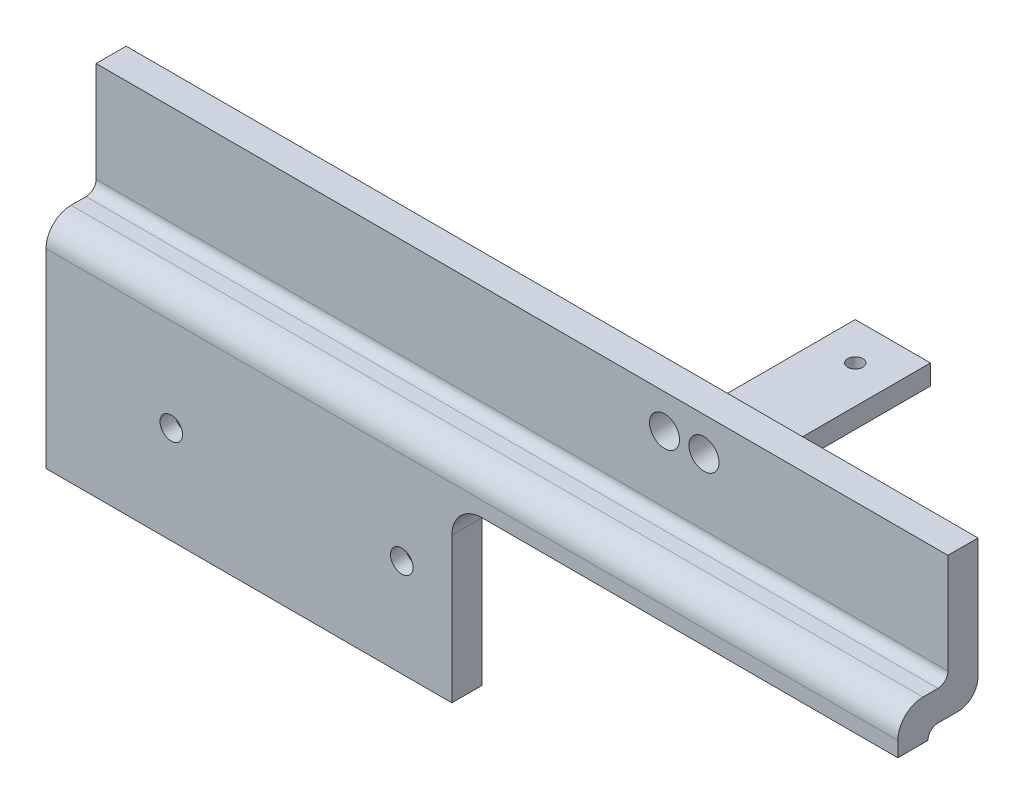
ISO-10303-21;
HEADER;
FILE_DESCRIPTION(('STEP AP214'),'2;1');
FILE_NAME('part.step','',(''),(''),'','','');
FILE_SCHEMA(('AUTOMOTIVE_DESIGN { 1 0 10303 214 1 1 1 1 }'));
ENDSEC;
DATA;
#1=APPLICATION_CONTEXT('core data for automotive mechanical design processes');
#2=APPLICATION_PROTOCOL_DEFINITION('international standard','automotive_design',2000,#1);
#3=PRODUCT_CONTEXT('',#1,'mechanical');
#4=PRODUCT('Part','Part','',(#3));
#5=PRODUCT_RELATED_PRODUCT_CATEGORY('part','',(#4));
#6=PRODUCT_DEFINITION_FORMATION('','',#4);
#7=PRODUCT_DEFINITION_CONTEXT('part definition',#1,'design');
#8=PRODUCT_DEFINITION('design','',#6,#7);
#9=PRODUCT_DEFINITION_SHAPE('','',#8);
#10=(LENGTH_UNIT() NAMED_UNIT(*) SI_UNIT(.MILLI.,.METRE.));
#11=(NAMED_UNIT(*) PLANE_ANGLE_UNIT() SI_UNIT($,.RADIAN.));
#12=(NAMED_UNIT(*) SI_UNIT($,.STERADIAN.) SOLID_ANGLE_UNIT());
#13=UNCERTAINTY_MEASURE_WITH_UNIT(LENGTH_MEASURE(1.E-05),#10,'distance_accuracy_value','');
#14=(GEOMETRIC_REPRESENTATION_CONTEXT(3) GLOBAL_UNCERTAINTY_ASSIGNED_CONTEXT((#13)) GLOBAL_UNIT_ASSIGNED_CONTEXT((#10,
#11,#12)) REPRESENTATION_CONTEXT('',''));
#15=CARTESIAN_POINT('',(0.,0.,0.));
#16=DIRECTION('',(0.,0.,1.));
#17=DIRECTION('',(1.,0.,0.));
#18=AXIS2_PLACEMENT_3D('',#15,#16,#17);
#19=CARTESIAN_POINT('',(170.,41.,-16.));
#20=DIRECTION('',(0.,0.,1.));
#21=DIRECTION('',(1.,0.,0.));
#22=AXIS2_PLACEMENT_3D('',#19,#20,#21);
#23=PLANE('',#22);
#24=CARTESIAN_POINT('',(121.31,58.175,-16.));
#25=DIRECTION('',(0.,0.,-1.));
#26=DIRECTION('',(-1.,0.,0.));
#27=AXIS2_PLACEMENT_3D('',#24,#25,#26);
#28=CIRCLE('',#27,3.00000000000001);
#29=CARTESIAN_POINT('',(118.31,58.175,-16.));
#30=VERTEX_POINT('',#29);
#31=EDGE_CURVE('E358',#30,#30,#28,.T.);
#32=ORIENTED_EDGE('',*,*,#31,.F.);
#33=EDGE_LOOP('',(#32));
#34=FACE_BOUND('',#33,.T.);
#35=CARTESIAN_POINT('',(113.436,58.175,-16.));
#36=DIRECTION('',(0.,0.,-1.));
#37=DIRECTION('',(-1.,0.,0.));
#38=AXIS2_PLACEMENT_3D('',#35,#36,#37);
#39=CIRCLE('',#38,3.00000000000001);
#40=CARTESIAN_POINT('',(110.436,58.175,-16.));
#41=VERTEX_POINT('',#40);
#42=EDGE_CURVE('E866',#41,#41,#39,.T.);
#43=ORIENTED_EDGE('',*,*,#42,.F.);
#44=EDGE_LOOP('',(#43));
#45=FACE_BOUND('',#44,.T.);
#46=DIRECTION('',(1.,0.,0.));
#47=VECTOR('',#46,1.);
#48=CARTESIAN_POINT('',(110.,55.,-16.));
#49=LINE('',#48,#47);
#50=CARTESIAN_POINT('',(108.,55.,-16.));
#51=VERTEX_POINT('',#50);
#52=CARTESIAN_POINT('',(127.,55.,-16.));
#53=VERTEX_POINT('',#52);
#54=EDGE_CURVE('E205',#51,#53,#49,.T.);
#55=ORIENTED_EDGE('',*,*,#54,.F.);
#56=DIRECTION('',(0.,-1.,0.));
#57=VECTOR('',#56,1.);
#58=CARTESIAN_POINT('',(108.,41.,-16.));
#59=LINE('',#58,#57);
#60=CARTESIAN_POINT('',(108.,41.,-16.));
#61=VERTEX_POINT('',#60);
#62=EDGE_CURVE('E371',#51,#61,#59,.T.);
#63=ORIENTED_EDGE('',*,*,#62,.T.);
#64=DIRECTION('',(-1.,0.,0.));
#65=VECTOR('',#64,1.);
#66=CARTESIAN_POINT('',(170.,41.,-16.));
#67=LINE('',#66,#65);
#68=CARTESIAN_POINT('',(0.,41.,-16.));
#69=VERTEX_POINT('',#68);
#70=EDGE_CURVE('E314',#61,#69,#67,.T.);
#71=ORIENTED_EDGE('',*,*,#70,.T.);
#72=DIRECTION('',(0.,1.,0.));
#73=VECTOR('',#72,1.);
#74=CARTESIAN_POINT('',(0.,41.,-16.));
#75=LINE('',#74,#73);
#76=CARTESIAN_POINT('',(0.,65.,-16.));
#77=VERTEX_POINT('',#76);
#78=EDGE_CURVE('E286',#69,#77,#75,.T.);
#79=ORIENTED_EDGE('',*,*,#78,.T.);
#80=DIRECTION('',(-1.,0.,0.));
#81=VECTOR('',#80,1.);
#82=CARTESIAN_POINT('',(170.,65.,-16.));
#83=LINE('',#82,#81);
#84=CARTESIAN_POINT('',(170.,65.,-16.));
#85=VERTEX_POINT('',#84);
#86=EDGE_CURVE('E311',#85,#77,#83,.T.);
#87=ORIENTED_EDGE('',*,*,#86,.F.);
#88=DIRECTION('',(0.,1.,0.));
#89=VECTOR('',#88,1.);
#90=CARTESIAN_POINT('',(170.,41.,-16.));
#91=LINE('',#90,#89);
#92=CARTESIAN_POINT('',(170.,41.,-16.));
#93=VERTEX_POINT('',#92);
#94=EDGE_CURVE('E257',#93,#85,#91,.T.);
#95=ORIENTED_EDGE('',*,*,#94,.F.);
#96=CARTESIAN_POINT('',(127.,41.,-16.));
#97=VERTEX_POINT('',#96);
#98=EDGE_CURVE('E315',#93,#97,#67,.T.);
#99=ORIENTED_EDGE('',*,*,#98,.T.);
#100=DIRECTION('',(0.,1.,0.));
#101=VECTOR('',#100,1.);
#102=CARTESIAN_POINT('',(127.,55.,-16.));
#103=LINE('',#102,#101);
#104=EDGE_CURVE('E368',#97,#53,#103,.T.);
#105=ORIENTED_EDGE('',*,*,#104,.T.);
#106=EDGE_LOOP('',(#55,#63,#71,#79,#87,#95,#99,#105));
#107=FACE_BOUND('',#106,.T.);
#108=ADVANCED_FACE('F41',(#34,#45,#107),#23,.F.);
#109=CARTESIAN_POINT('',(170.,38.,0.));
#110=DIRECTION('',(0.,0.,-1.));
#111=DIRECTION('',(0.,1.,0.));
#112=AXIS2_PLACEMENT_3D('',#109,#110,#111);
#113=PLANE('',#112);
#114=CARTESIAN_POINT('',(25.,19.5,0.));
#115=DIRECTION('',(0.,0.,-1.));
#116=DIRECTION('',(0.,1.,0.));
#117=AXIS2_PLACEMENT_3D('',#114,#115,#116);
#118=CIRCLE('',#117,2.24999999999999);
#119=CARTESIAN_POINT('',(25.,21.75,0.));
#120=VERTEX_POINT('',#119);
#121=EDGE_CURVE('E236',#120,#120,#118,.T.);
#122=ORIENTED_EDGE('',*,*,#121,.T.);
#123=EDGE_LOOP('',(#122));
#124=FACE_BOUND('',#123,.T.);
#125=CARTESIAN_POINT('',(71.,19.5,0.));
#126=DIRECTION('',(0.,0.,-1.));
#127=DIRECTION('',(0.,1.,0.));
#128=AXIS2_PLACEMENT_3D('',#125,#126,#127);
#129=CIRCLE('',#128,2.25);
#130=CARTESIAN_POINT('',(71.,21.75,0.));
#131=VERTEX_POINT('',#130);
#132=EDGE_CURVE('E246',#131,#131,#129,.T.);
#133=ORIENTED_EDGE('',*,*,#132,.T.);
#134=EDGE_LOOP('',(#133));
#135=FACE_BOUND('',#134,.T.);
#136=DIRECTION('',(0.,1.,0.));
#137=VECTOR('',#136,1.);
#138=CARTESIAN_POINT('',(81.,37.9999999999999,0.));
#139=LINE('',#138,#137);
#140=CARTESIAN_POINT('',(81.,0.,0.));
#141=VERTEX_POINT('',#140);
#142=CARTESIAN_POINT('',(81.,29.,0.));
#143=VERTEX_POINT('',#142);
#144=EDGE_CURVE('E224',#141,#143,#139,.T.);
#145=ORIENTED_EDGE('',*,*,#144,.T.);
#146=CARTESIAN_POINT('',(87.,29.,0.));
#147=DIRECTION('',(0.,0.,-1.));
#148=DIRECTION('',(0.,1.,0.));
#149=AXIS2_PLACEMENT_3D('',#146,#147,#148);
#150=CIRCLE('',#149,6.);
#151=CARTESIAN_POINT('',(87.,35.,0.));
#152=VERTEX_POINT('',#151);
#153=EDGE_CURVE('E347',#143,#152,#150,.T.);
#154=ORIENTED_EDGE('',*,*,#153,.T.);
#155=DIRECTION('',(1.,0.,0.));
#156=VECTOR('',#155,1.);
#157=CARTESIAN_POINT('',(170.,35.,0.));
#158=LINE('',#157,#156);
#159=CARTESIAN_POINT('',(170.,35.,0.));
#160=VERTEX_POINT('',#159);
#161=EDGE_CURVE('E222',#152,#160,#158,.T.);
#162=ORIENTED_EDGE('',*,*,#161,.T.);
#163=DIRECTION('',(0.,-1.,0.));
#164=VECTOR('',#163,1.);
#165=CARTESIAN_POINT('',(170.,38.,0.));
#166=LINE('',#165,#164);
#167=CARTESIAN_POINT('',(170.,38.,0.));
#168=VERTEX_POINT('',#167);
#169=EDGE_CURVE('E247',#168,#160,#166,.T.);
#170=ORIENTED_EDGE('',*,*,#169,.F.);
#171=DIRECTION('',(-1.,0.,0.));
#172=VECTOR('',#171,1.);
#173=CARTESIAN_POINT('',(170.,38.,0.));
#174=LINE('',#173,#172);
#175=CARTESIAN_POINT('',(0.,38.,0.));
#176=VERTEX_POINT('',#175);
#177=EDGE_CURVE('E269',#168,#176,#174,.T.);
#178=ORIENTED_EDGE('',*,*,#177,.T.);
#179=DIRECTION('',(0.,-1.,0.));
#180=VECTOR('',#179,1.);
#181=CARTESIAN_POINT('',(0.,38.,0.));
#182=LINE('',#181,#180);
#183=CARTESIAN_POINT('',(0.,0.,0.));
#184=VERTEX_POINT('',#183);
#185=EDGE_CURVE('E270',#176,#184,#182,.T.);
#186=ORIENTED_EDGE('',*,*,#185,.T.);
#187=DIRECTION('',(-1.,0.,0.));
#188=VECTOR('',#187,1.);
#189=CARTESIAN_POINT('',(170.,0.,0.));
#190=LINE('',#189,#188);
#191=EDGE_CURVE('E331',#141,#184,#190,.T.);
#192=ORIENTED_EDGE('',*,*,#191,.F.);
#193=EDGE_LOOP('',(#145,#154,#162,#170,#178,#186,#192));
#194=FACE_BOUND('',#193,.T.);
#195=ADVANCED_FACE('F445',(#124,#135,#194),#113,.F.);
#196=CARTESIAN_POINT('',(170.,0.,0.));
#197=DIRECTION('',(0.,1.,0.));
#198=DIRECTION('',(0.,0.,1.));
#199=AXIS2_PLACEMENT_3D('',#196,#197,#198);
#200=PLANE('',#199);
#201=DIRECTION('',(-1.,0.,0.));
#202=VECTOR('',#201,1.);
#203=CARTESIAN_POINT('',(170.,0.,-6.));
#204=LINE('',#203,#202);
#205=CARTESIAN_POINT('',(81.,0.,-6.));
#206=VERTEX_POINT('',#205);
#207=CARTESIAN_POINT('',(0.,0.,-6.));
#208=VERTEX_POINT('',#207);
#209=EDGE_CURVE('E329',#206,#208,#204,.T.);
#210=ORIENTED_EDGE('',*,*,#209,.F.);
#211=DIRECTION('',(0.,0.,-1.));
#212=VECTOR('',#211,1.);
#213=CARTESIAN_POINT('',(81.,0.,164.));
#214=LINE('',#213,#212);
#215=EDGE_CURVE('E215',#141,#206,#214,.T.);
#216=ORIENTED_EDGE('',*,*,#215,.F.);
#217=ORIENTED_EDGE('',*,*,#191,.T.);
#218=DIRECTION('',(0.,0.,-1.));
#219=VECTOR('',#218,1.);
#220=CARTESIAN_POINT('',(0.,0.,0.));
#221=LINE('',#220,#219);
#222=EDGE_CURVE('E273',#184,#208,#221,.T.);
#223=ORIENTED_EDGE('',*,*,#222,.T.);
#224=EDGE_LOOP('',(#210,#216,#217,#223));
#225=FACE_BOUND('',#224,.T.);
#226=ADVANCED_FACE('F441',(#225),#200,.F.);
#227=CARTESIAN_POINT('',(170.,0.,-6.));
#228=DIRECTION('',(0.,0.,1.));
#229=DIRECTION('',(1.,0.,0.));
#230=AXIS2_PLACEMENT_3D('',#227,#228,#229);
#231=PLANE('',#230);
#232=CARTESIAN_POINT('',(25.,19.5,-6.));
#233=DIRECTION('',(0.,0.,-1.));
#234=DIRECTION('',(-1.,0.,0.));
#235=AXIS2_PLACEMENT_3D('',#232,#233,#234);
#236=CIRCLE('',#235,4.99999999999999);
#237=CARTESIAN_POINT('',(20.,19.5,-6.));
#238=VERTEX_POINT('',#237);
#239=EDGE_CURVE('E227',#238,#238,#236,.T.);
#240=ORIENTED_EDGE('',*,*,#239,.F.);
#241=EDGE_LOOP('',(#240));
#242=FACE_BOUND('',#241,.T.);
#243=CARTESIAN_POINT('',(71.,19.5,-6.));
#244=DIRECTION('',(0.,0.,-1.));
#245=DIRECTION('',(-1.,0.,0.));
#246=AXIS2_PLACEMENT_3D('',#243,#244,#245);
#247=CIRCLE('',#246,4.99999999999999);
#248=CARTESIAN_POINT('',(66.,19.5,-6.));
#249=VERTEX_POINT('',#248);
#250=EDGE_CURVE('E237',#249,#249,#247,.T.);
#251=ORIENTED_EDGE('',*,*,#250,.F.);
#252=EDGE_LOOP('',(#251));
#253=FACE_BOUND('',#252,.T.);
#254=DIRECTION('',(-1.,0.,0.));
#255=VECTOR('',#254,1.);
#256=CARTESIAN_POINT('',(170.,35.,-6.));
#257=LINE('',#256,#255);
#258=CARTESIAN_POINT('',(87.,35.,-6.));
#259=VERTEX_POINT('',#258);
#260=CARTESIAN_POINT('',(0.,35.,-6.));
#261=VERTEX_POINT('',#260);
#262=EDGE_CURVE('E325',#259,#261,#257,.T.);
#263=ORIENTED_EDGE('',*,*,#262,.F.);
#264=CARTESIAN_POINT('',(87.,29.,-6.00000000000001));
#265=DIRECTION('',(0.,0.,1.));
#266=DIRECTION('',(1.,0.,0.));
#267=AXIS2_PLACEMENT_3D('',#264,#265,#266);
#268=CIRCLE('',#267,6.);
#269=CARTESIAN_POINT('',(81.,29.,-6.));
#270=VERTEX_POINT('',#269);
#271=EDGE_CURVE('E345',#259,#270,#268,.T.);
#272=ORIENTED_EDGE('',*,*,#271,.T.);
#273=DIRECTION('',(0.,1.,0.));
#274=VECTOR('',#273,1.);
#275=CARTESIAN_POINT('',(81.,0.,-6.));
#276=LINE('',#275,#274);
#277=EDGE_CURVE('E212',#206,#270,#276,.T.);
#278=ORIENTED_EDGE('',*,*,#277,.F.);
#279=ORIENTED_EDGE('',*,*,#209,.T.);
#280=DIRECTION('',(0.,1.,0.));
#281=VECTOR('',#280,1.);
#282=CARTESIAN_POINT('',(0.,0.,-6.));
#283=LINE('',#282,#281);
#284=EDGE_CURVE('E276',#208,#261,#283,.T.);
#285=ORIENTED_EDGE('',*,*,#284,.T.);
#286=EDGE_LOOP('',(#263,#272,#278,#279,#285));
#287=FACE_BOUND('',#286,.T.);
#288=ADVANCED_FACE('F436',(#242,#253,#287),#231,.F.);
#289=CARTESIAN_POINT('',(170.,35.,-8.));
#290=DIRECTION('',(-1.,0.,0.));
#291=DIRECTION('',(0.,0.,1.));
#292=AXIS2_PLACEMENT_3D('',#289,#290,#291);
#293=CYLINDRICAL_SURFACE('',#292,2.);
#294=CARTESIAN_POINT('',(0.,35.,-8.));
#295=DIRECTION('',(-1.,0.,0.));
#296=DIRECTION('',(0.,0.,-1.));
#297=AXIS2_PLACEMENT_3D('',#294,#295,#296);
#298=CIRCLE('',#297,2.);
#299=CARTESIAN_POINT('',(0.,37.,-8.00000000000001));
#300=VERTEX_POINT('',#299);
#301=EDGE_CURVE('E279',#261,#300,#298,.T.);
#302=ORIENTED_EDGE('',*,*,#301,.T.);
#303=DIRECTION('',(-1.,0.,0.));
#304=VECTOR('',#303,1.);
#305=CARTESIAN_POINT('',(170.,37.,-8.00000000000001));
#306=LINE('',#305,#304);
#307=CARTESIAN_POINT('',(170.,37.,-8.00000000000001));
#308=VERTEX_POINT('',#307);
#309=EDGE_CURVE('E322',#308,#300,#306,.T.);
#310=ORIENTED_EDGE('',*,*,#309,.F.);
#311=CARTESIAN_POINT('',(170.,35.,-8.));
#312=DIRECTION('',(-1.,0.,0.));
#313=DIRECTION('',(0.,0.,-1.));
#314=AXIS2_PLACEMENT_3D('',#311,#312,#313);
#315=CIRCLE('',#314,2.);
#316=CARTESIAN_POINT('',(170.,35.,-6.));
#317=VERTEX_POINT('',#316);
#318=EDGE_CURVE('E250',#317,#308,#315,.T.);
#319=ORIENTED_EDGE('',*,*,#318,.F.);
#320=EDGE_CURVE('E326',#317,#259,#257,.T.);
#321=ORIENTED_EDGE('',*,*,#320,.T.);
#322=ORIENTED_EDGE('',*,*,#262,.T.);
#323=EDGE_LOOP('',(#302,#310,#319,#321,#322));
#324=FACE_BOUND('',#323,.T.);
#325=ADVANCED_FACE('F433',(#324),#293,.F.);
#326=CARTESIAN_POINT('',(170.,37.,-8.00000000000001));
#327=DIRECTION('',(0.,1.,0.));
#328=DIRECTION('',(0.,0.,1.));
#329=AXIS2_PLACEMENT_3D('',#326,#327,#328);
#330=PLANE('',#329);
#331=DIRECTION('',(0.,0.,-1.));
#332=VECTOR('',#331,1.);
#333=CARTESIAN_POINT('',(0.,37.,-8.00000000000001));
#334=LINE('',#333,#332);
#335=CARTESIAN_POINT('',(0.,37.,-12.));
#336=VERTEX_POINT('',#335);
#337=EDGE_CURVE('E281',#300,#336,#334,.T.);
#338=ORIENTED_EDGE('',*,*,#337,.T.);
#339=DIRECTION('',(-1.,0.,0.));
#340=VECTOR('',#339,1.);
#341=CARTESIAN_POINT('',(170.,37.,-12.));
#342=LINE('',#341,#340);
#343=CARTESIAN_POINT('',(170.,37.,-12.));
#344=VERTEX_POINT('',#343);
#345=EDGE_CURVE('E318',#344,#336,#342,.T.);
#346=ORIENTED_EDGE('',*,*,#345,.F.);
#347=DIRECTION('',(0.,0.,-1.));
#348=VECTOR('',#347,1.);
#349=CARTESIAN_POINT('',(170.,37.,-8.00000000000001));
#350=LINE('',#349,#348);
#351=EDGE_CURVE('E253',#308,#344,#350,.T.);
#352=ORIENTED_EDGE('',*,*,#351,.F.);
#353=ORIENTED_EDGE('',*,*,#309,.T.);
#354=EDGE_LOOP('',(#338,#346,#352,#353));
#355=FACE_BOUND('',#354,.T.);
#356=ADVANCED_FACE('F428',(#355),#330,.F.);
#357=CARTESIAN_POINT('',(170.,41.,-12.));
#358=DIRECTION('',(-1.,0.,0.));
#359=DIRECTION('',(0.,0.,1.));
#360=AXIS2_PLACEMENT_3D('',#357,#358,#359);
#361=CYLINDRICAL_SURFACE('',#360,4.);
#362=CARTESIAN_POINT('',(0.,41.,-12.));
#363=DIRECTION('',(1.,0.,0.));
#364=DIRECTION('',(0.,0.,-1.));
#365=AXIS2_PLACEMENT_3D('',#362,#363,#364);
#366=CIRCLE('',#365,4.);
#367=EDGE_CURVE('E283',#336,#69,#366,.T.);
#368=ORIENTED_EDGE('',*,*,#367,.T.);
#369=ORIENTED_EDGE('',*,*,#70,.F.);
#370=EDGE_CURVE('E319',#97,#61,#67,.T.);
#371=ORIENTED_EDGE('',*,*,#370,.F.);
#372=ORIENTED_EDGE('',*,*,#98,.F.);
#373=CARTESIAN_POINT('',(170.,41.,-12.));
#374=DIRECTION('',(1.,0.,0.));
#375=DIRECTION('',(0.,0.,-1.));
#376=AXIS2_PLACEMENT_3D('',#373,#374,#375);
#377=CIRCLE('',#376,4.);
#378=EDGE_CURVE('E255',#344,#93,#377,.T.);
#379=ORIENTED_EDGE('',*,*,#378,.F.);
#380=ORIENTED_EDGE('',*,*,#345,.T.);
#381=EDGE_LOOP('',(#368,#369,#371,#372,#379,#380));
#382=FACE_BOUND('',#381,.T.);
#383=ADVANCED_FACE('F405',(#382),#361,.T.);
#384=CARTESIAN_POINT('',(170.,65.,-16.));
#385=DIRECTION('',(0.,-1.,0.));
#386=DIRECTION('',(0.,0.,-1.));
#387=AXIS2_PLACEMENT_3D('',#384,#385,#386);
#388=PLANE('',#387);
#389=DIRECTION('',(0.,0.,1.));
#390=VECTOR('',#389,1.);
#391=CARTESIAN_POINT('',(0.,65.,-16.));
#392=LINE('',#391,#390);
#393=CARTESIAN_POINT('',(0.,65.,-10.));
#394=VERTEX_POINT('',#393);
#395=EDGE_CURVE('E288',#77,#394,#392,.T.);
#396=ORIENTED_EDGE('',*,*,#395,.T.);
#397=DIRECTION('',(-1.,0.,0.));
#398=VECTOR('',#397,1.);
#399=CARTESIAN_POINT('',(170.,65.,-10.));
#400=LINE('',#399,#398);
#401=CARTESIAN_POINT('',(170.,65.,-10.));
#402=VERTEX_POINT('',#401);
#403=EDGE_CURVE('E308',#402,#394,#400,.T.);
#404=ORIENTED_EDGE('',*,*,#403,.F.);
#405=DIRECTION('',(0.,0.,1.));
#406=VECTOR('',#405,1.);
#407=CARTESIAN_POINT('',(170.,65.,-16.));
#408=LINE('',#407,#406);
#409=EDGE_CURVE('E259',#85,#402,#408,.T.);
#410=ORIENTED_EDGE('',*,*,#409,.F.);
#411=ORIENTED_EDGE('',*,*,#86,.T.);
#412=EDGE_LOOP('',(#396,#404,#410,#411));
#413=FACE_BOUND('',#412,.T.);
#414=ADVANCED_FACE('F417',(#413),#388,.F.);
#415=CARTESIAN_POINT('',(170.,65.,-10.));
#416=DIRECTION('',(0.,0.,-1.));
#417=DIRECTION('',(0.,1.,0.));
#418=AXIS2_PLACEMENT_3D('',#415,#416,#417);
#419=PLANE('',#418);
#420=CARTESIAN_POINT('',(121.31,58.175,-10.));
#421=DIRECTION('',(0.,0.,-1.));
#422=DIRECTION('',(0.,1.,0.));
#423=AXIS2_PLACEMENT_3D('',#420,#421,#422);
#424=CIRCLE('',#423,3.00000000000001);
#425=CARTESIAN_POINT('',(121.31,61.175,-10.));
#426=VERTEX_POINT('',#425);
#427=EDGE_CURVE('E357',#426,#426,#424,.T.);
#428=ORIENTED_EDGE('',*,*,#427,.T.);
#429=EDGE_LOOP('',(#428));
#430=FACE_BOUND('',#429,.T.);
#431=CARTESIAN_POINT('',(113.436,58.175,-10.));
#432=DIRECTION('',(0.,0.,-1.));
#433=DIRECTION('',(0.,1.,0.));
#434=AXIS2_PLACEMENT_3D('',#431,#432,#433);
#435=CIRCLE('',#434,3.00000000000001);
#436=CARTESIAN_POINT('',(113.436,61.175,-10.));
#437=VERTEX_POINT('',#436);
#438=EDGE_CURVE('E354',#437,#437,#435,.T.);
#439=ORIENTED_EDGE('',*,*,#438,.T.);
#440=EDGE_LOOP('',(#439));
#441=FACE_BOUND('',#440,.T.);
#442=DIRECTION('',(0.,-1.,0.));
#443=VECTOR('',#442,1.);
#444=CARTESIAN_POINT('',(0.,65.,-10.));
#445=LINE('',#444,#443);
#446=CARTESIAN_POINT('',(0.,45.,-10.));
#447=VERTEX_POINT('',#446);
#448=EDGE_CURVE('E290',#394,#447,#445,.T.);
#449=ORIENTED_EDGE('',*,*,#448,.T.);
#450=DIRECTION('',(-1.,0.,0.));
#451=VECTOR('',#450,1.);
#452=CARTESIAN_POINT('',(170.,45.,-10.));
#453=LINE('',#452,#451);
#454=CARTESIAN_POINT('',(170.,45.,-10.));
#455=VERTEX_POINT('',#454);
#456=EDGE_CURVE('E305',#455,#447,#453,.T.);
#457=ORIENTED_EDGE('',*,*,#456,.F.);
#458=DIRECTION('',(0.,-1.,0.));
#459=VECTOR('',#458,1.);
#460=CARTESIAN_POINT('',(170.,65.,-10.));
#461=LINE('',#460,#459);
#462=EDGE_CURVE('E261',#402,#455,#461,.T.);
#463=ORIENTED_EDGE('',*,*,#462,.F.);
#464=ORIENTED_EDGE('',*,*,#403,.T.);
#465=EDGE_LOOP('',(#449,#457,#463,#464));
#466=FACE_BOUND('',#465,.T.);
#467=ADVANCED_FACE('F462',(#430,#441,#466),#419,.F.);
#468=CARTESIAN_POINT('',(170.,45.,-8.00000000000001));
#469=DIRECTION('',(-1.,0.,0.));
#470=DIRECTION('',(0.,0.,1.));
#471=AXIS2_PLACEMENT_3D('',#468,#469,#470);
#472=CYLINDRICAL_SURFACE('',#471,2.);
#473=CARTESIAN_POINT('',(0.,45.,-8.00000000000001));
#474=DIRECTION('',(-1.,0.,0.));
#475=DIRECTION('',(0.,0.,1.));
#476=AXIS2_PLACEMENT_3D('',#473,#474,#475);
#477=CIRCLE('',#476,2.);
#478=CARTESIAN_POINT('',(0.,43.,-7.99999999999999));
#479=VERTEX_POINT('',#478);
#480=EDGE_CURVE('E292',#447,#479,#477,.T.);
#481=ORIENTED_EDGE('',*,*,#480,.T.);
#482=DIRECTION('',(-1.,0.,0.));
#483=VECTOR('',#482,1.);
#484=CARTESIAN_POINT('',(170.,43.,-7.99999999999999));
#485=LINE('',#484,#483);
#486=CARTESIAN_POINT('',(170.,43.,-7.99999999999999));
#487=VERTEX_POINT('',#486);
#488=EDGE_CURVE('E302',#487,#479,#485,.T.);
#489=ORIENTED_EDGE('',*,*,#488,.F.);
#490=CARTESIAN_POINT('',(170.,45.,-8.00000000000001));
#491=DIRECTION('',(-1.,0.,0.));
#492=DIRECTION('',(0.,0.,1.));
#493=AXIS2_PLACEMENT_3D('',#490,#491,#492);
#494=CIRCLE('',#493,2.);
#495=EDGE_CURVE('E263',#455,#487,#494,.T.);
#496=ORIENTED_EDGE('',*,*,#495,.F.);
#497=ORIENTED_EDGE('',*,*,#456,.T.);
#498=EDGE_LOOP('',(#481,#489,#496,#497));
#499=FACE_BOUND('',#498,.T.);
#500=ADVANCED_FACE('F460',(#499),#472,.F.);
#501=CARTESIAN_POINT('',(170.,43.,-7.99999999999999));
#502=DIRECTION('',(0.,-1.,0.));
#503=DIRECTION('',(0.,0.,-1.));
#504=AXIS2_PLACEMENT_3D('',#501,#502,#503);
#505=PLANE('',#504);
#506=DIRECTION('',(0.,0.,1.));
#507=VECTOR('',#506,1.);
#508=CARTESIAN_POINT('',(0.,43.,-7.99999999999999));
#509=LINE('',#508,#507);
#510=CARTESIAN_POINT('',(0.,43.,-5.00000000000003));
#511=VERTEX_POINT('',#510);
#512=EDGE_CURVE('E294',#479,#511,#509,.T.);
#513=ORIENTED_EDGE('',*,*,#512,.T.);
#514=DIRECTION('',(-1.,0.,0.));
#515=VECTOR('',#514,1.);
#516=CARTESIAN_POINT('',(170.,43.,-5.00000000000003));
#517=LINE('',#516,#515);
#518=CARTESIAN_POINT('',(170.,43.,-5.00000000000003));
#519=VERTEX_POINT('',#518);
#520=EDGE_CURVE('E299',#519,#511,#517,.T.);
#521=ORIENTED_EDGE('',*,*,#520,.F.);
#522=DIRECTION('',(0.,0.,1.));
#523=VECTOR('',#522,1.);
#524=CARTESIAN_POINT('',(170.,43.,-7.99999999999999));
#525=LINE('',#524,#523);
#526=EDGE_CURVE('E265',#487,#519,#525,.T.);
#527=ORIENTED_EDGE('',*,*,#526,.F.);
#528=ORIENTED_EDGE('',*,*,#488,.T.);
#529=EDGE_LOOP('',(#513,#521,#527,#528));
#530=FACE_BOUND('',#529,.T.);
#531=ADVANCED_FACE('F455',(#530),#505,.F.);
#532=CARTESIAN_POINT('',(170.,38.,-5.));
#533=DIRECTION('',(-1.,0.,0.));
#534=DIRECTION('',(0.,0.,1.));
#535=AXIS2_PLACEMENT_3D('',#532,#533,#534);
#536=CYLINDRICAL_SURFACE('',#535,5.);
#537=CARTESIAN_POINT('',(0.,38.,-5.));
#538=DIRECTION('',(1.,0.,0.));
#539=DIRECTION('',(0.,0.,-1.));
#540=AXIS2_PLACEMENT_3D('',#537,#538,#539);
#541=CIRCLE('',#540,5.);
#542=EDGE_CURVE('E251',#511,#176,#541,.T.);
#543=ORIENTED_EDGE('',*,*,#542,.T.);
#544=ORIENTED_EDGE('',*,*,#177,.F.);
#545=CARTESIAN_POINT('',(170.,38.,-5.));
#546=DIRECTION('',(1.,0.,0.));
#547=DIRECTION('',(0.,0.,-1.));
#548=AXIS2_PLACEMENT_3D('',#545,#546,#547);
#549=CIRCLE('',#548,5.);
#550=EDGE_CURVE('E267',#519,#168,#549,.T.);
#551=ORIENTED_EDGE('',*,*,#550,.F.);
#552=ORIENTED_EDGE('',*,*,#520,.T.);
#553=EDGE_LOOP('',(#543,#544,#551,#552));
#554=FACE_BOUND('',#553,.T.);
#555=ADVANCED_FACE('F450',(#554),#536,.T.);
#556=CARTESIAN_POINT('',(170.,35.,-8.));
#557=DIRECTION('',(1.,0.,0.));
#558=DIRECTION('',(0.,0.,-1.));
#559=AXIS2_PLACEMENT_3D('',#556,#557,#558);
#560=PLANE('',#559);
#561=DIRECTION('',(0.,0.,1.));
#562=VECTOR('',#561,1.);
#563=CARTESIAN_POINT('',(170.,35.,-8.));
#564=LINE('',#563,#562);
#565=EDGE_CURVE('E333',#317,#160,#564,.T.);
#566=ORIENTED_EDGE('',*,*,#565,.F.);
#567=ORIENTED_EDGE('',*,*,#318,.T.);
#568=ORIENTED_EDGE('',*,*,#351,.T.);
#569=ORIENTED_EDGE('',*,*,#378,.T.);
#570=ORIENTED_EDGE('',*,*,#94,.T.);
#571=ORIENTED_EDGE('',*,*,#409,.T.);
#572=ORIENTED_EDGE('',*,*,#462,.T.);
#573=ORIENTED_EDGE('',*,*,#495,.T.);
#574=ORIENTED_EDGE('',*,*,#526,.T.);
#575=ORIENTED_EDGE('',*,*,#550,.T.);
#576=ORIENTED_EDGE('',*,*,#169,.T.);
#577=EDGE_LOOP('',(#566,#567,#568,#569,#570,#571,#572,#573,#574,#575,#576));
#578=FACE_BOUND('',#577,.T.);
#579=ADVANCED_FACE('F422',(#578),#560,.T.);
#580=CARTESIAN_POINT('',(0.,35.,-8.));
#581=DIRECTION('',(1.,0.,0.));
#582=DIRECTION('',(0.,0.,-1.));
#583=AXIS2_PLACEMENT_3D('',#580,#581,#582);
#584=PLANE('',#583);
#585=ORIENTED_EDGE('',*,*,#185,.F.);
#586=ORIENTED_EDGE('',*,*,#542,.F.);
#587=ORIENTED_EDGE('',*,*,#512,.F.);
#588=ORIENTED_EDGE('',*,*,#480,.F.);
#589=ORIENTED_EDGE('',*,*,#448,.F.);
#590=ORIENTED_EDGE('',*,*,#395,.F.);
#591=ORIENTED_EDGE('',*,*,#78,.F.);
#592=ORIENTED_EDGE('',*,*,#367,.F.);
#593=ORIENTED_EDGE('',*,*,#337,.F.);
#594=ORIENTED_EDGE('',*,*,#301,.F.);
#595=ORIENTED_EDGE('',*,*,#284,.F.);
#596=ORIENTED_EDGE('',*,*,#222,.F.);
#597=EDGE_LOOP('',(#585,#586,#587,#588,#589,#590,#591,#592,#593,#594,#595,#596));
#598=FACE_BOUND('',#597,.T.);
#599=ADVANCED_FACE('F413',(#598),#584,.F.);
#600=CARTESIAN_POINT('',(71.,19.5,-6.));
#601=DIRECTION('',(0.,0.,-1.));
#602=DIRECTION('',(-1.,0.,0.));
#603=AXIS2_PLACEMENT_3D('',#600,#601,#602);
#604=CYLINDRICAL_SURFACE('',#603,2.25);
#605=CARTESIAN_POINT('',(71.,19.5,-3.));
#606=DIRECTION('',(0.,0.,-1.));
#607=DIRECTION('',(-1.,0.,0.));
#608=AXIS2_PLACEMENT_3D('',#605,#606,#607);
#609=CIRCLE('',#608,2.25);
#610=CARTESIAN_POINT('',(68.75,19.5,-3.));
#611=VERTEX_POINT('',#610);
#612=EDGE_CURVE('E243',#611,#611,#609,.T.);
#613=ORIENTED_EDGE('',*,*,#612,.T.);
#614=EDGE_LOOP('',(#613));
#615=FACE_BOUND('',#614,.T.);
#616=ORIENTED_EDGE('',*,*,#132,.F.);
#617=EDGE_LOOP('',(#616));
#618=FACE_BOUND('',#617,.T.);
#619=ADVANCED_FACE('F748',(#615,#618),#604,.F.);
#620=CARTESIAN_POINT('',(73.25,19.5,-3.));
#621=DIRECTION('',(0.,0.,1.));
#622=DIRECTION('',(1.,0.,0.));
#623=AXIS2_PLACEMENT_3D('',#620,#621,#622);
#624=PLANE('',#623);
#625=ORIENTED_EDGE('',*,*,#612,.F.);
#626=EDGE_LOOP('',(#625));
#627=FACE_BOUND('',#626,.T.);
#628=CARTESIAN_POINT('',(71.,19.5,-3.));
#629=DIRECTION('',(0.,0.,-1.));
#630=DIRECTION('',(-1.,0.,0.));
#631=AXIS2_PLACEMENT_3D('',#628,#629,#630);
#632=CIRCLE('',#631,4.99999999999999);
#633=CARTESIAN_POINT('',(66.,19.5,-3.));
#634=VERTEX_POINT('',#633);
#635=EDGE_CURVE('E240',#634,#634,#632,.T.);
#636=ORIENTED_EDGE('',*,*,#635,.T.);
#637=EDGE_LOOP('',(#636));
#638=FACE_BOUND('',#637,.T.);
#639=ADVANCED_FACE('F737',(#627,#638),#624,.F.);
#640=CARTESIAN_POINT('',(71.,19.5,-6.));
#641=DIRECTION('',(0.,0.,-1.));
#642=DIRECTION('',(-1.,0.,0.));
#643=AXIS2_PLACEMENT_3D('',#640,#641,#642);
#644=CYLINDRICAL_SURFACE('',#643,4.99999999999999);
#645=ORIENTED_EDGE('',*,*,#635,.F.);
#646=EDGE_LOOP('',(#645));
#647=FACE_BOUND('',#646,.T.);
#648=ORIENTED_EDGE('',*,*,#250,.T.);
#649=EDGE_LOOP('',(#648));
#650=FACE_BOUND('',#649,.T.);
#651=ADVANCED_FACE('F726',(#647,#650),#644,.F.);
#652=CARTESIAN_POINT('',(25.,19.5,-6.));
#653=DIRECTION('',(0.,0.,-1.));
#654=DIRECTION('',(-1.,0.,0.));
#655=AXIS2_PLACEMENT_3D('',#652,#653,#654);
#656=CYLINDRICAL_SURFACE('',#655,2.24999999999999);
#657=CARTESIAN_POINT('',(25.,19.5,-3.));
#658=DIRECTION('',(0.,0.,-1.));
#659=DIRECTION('',(-1.,0.,0.));
#660=AXIS2_PLACEMENT_3D('',#657,#658,#659);
#661=CIRCLE('',#660,2.25);
#662=CARTESIAN_POINT('',(22.75,19.5,-3.));
#663=VERTEX_POINT('',#662);
#664=EDGE_CURVE('E233',#663,#663,#661,.T.);
#665=ORIENTED_EDGE('',*,*,#664,.T.);
#666=EDGE_LOOP('',(#665));
#667=FACE_BOUND('',#666,.T.);
#668=ORIENTED_EDGE('',*,*,#121,.F.);
#669=EDGE_LOOP('',(#668));
#670=FACE_BOUND('',#669,.T.);
#671=ADVANCED_FACE('F715',(#667,#670),#656,.F.);
#672=CARTESIAN_POINT('',(27.25,19.5,-3.));
#673=DIRECTION('',(0.,0.,1.));
#674=DIRECTION('',(1.,0.,0.));
#675=AXIS2_PLACEMENT_3D('',#672,#673,#674);
#676=PLANE('',#675);
#677=ORIENTED_EDGE('',*,*,#664,.F.);
#678=EDGE_LOOP('',(#677));
#679=FACE_BOUND('',#678,.T.);
#680=CARTESIAN_POINT('',(25.,19.5,-3.));
#681=DIRECTION('',(0.,0.,-1.));
#682=DIRECTION('',(-1.,0.,0.));
#683=AXIS2_PLACEMENT_3D('',#680,#681,#682);
#684=CIRCLE('',#683,4.99999999999999);
#685=CARTESIAN_POINT('',(20.,19.5,-3.));
#686=VERTEX_POINT('',#685);
#687=EDGE_CURVE('E230',#686,#686,#684,.T.);
#688=ORIENTED_EDGE('',*,*,#687,.T.);
#689=EDGE_LOOP('',(#688));
#690=FACE_BOUND('',#689,.T.);
#691=ADVANCED_FACE('F704',(#679,#690),#676,.F.);
#692=CARTESIAN_POINT('',(25.,19.5,-6.));
#693=DIRECTION('',(0.,0.,-1.));
#694=DIRECTION('',(-1.,0.,0.));
#695=AXIS2_PLACEMENT_3D('',#692,#693,#694);
#696=CYLINDRICAL_SURFACE('',#695,4.99999999999999);
#697=ORIENTED_EDGE('',*,*,#687,.F.);
#698=EDGE_LOOP('',(#697));
#699=FACE_BOUND('',#698,.T.);
#700=ORIENTED_EDGE('',*,*,#239,.T.);
#701=EDGE_LOOP('',(#700));
#702=FACE_BOUND('',#701,.T.);
#703=ADVANCED_FACE('F652',(#699,#702),#696,.F.);
#704=CARTESIAN_POINT('',(81.,0.,164.));
#705=DIRECTION('',(-1.,0.,0.));
#706=DIRECTION('',(0.,-1.,0.));
#707=AXIS2_PLACEMENT_3D('',#704,#705,#706);
#708=PLANE('',#707);
#709=ORIENTED_EDGE('',*,*,#277,.T.);
#710=DIRECTION('',(0.,0.,-1.));
#711=VECTOR('',#710,1.);
#712=CARTESIAN_POINT('',(81.,29.,0.));
#713=LINE('',#712,#711);
#714=EDGE_CURVE('E343',#270,#143,#713,.F.);
#715=ORIENTED_EDGE('',*,*,#714,.T.);
#716=ORIENTED_EDGE('',*,*,#144,.F.);
#717=ORIENTED_EDGE('',*,*,#215,.T.);
#718=EDGE_LOOP('',(#709,#715,#716,#717));
#719=FACE_BOUND('',#718,.T.);
#720=ADVANCED_FACE('F641',(#719),#708,.F.);
#721=CARTESIAN_POINT('',(170.,35.,164.));
#722=DIRECTION('',(0.,1.,0.));
#723=DIRECTION('',(0.,0.,1.));
#724=AXIS2_PLACEMENT_3D('',#721,#722,#723);
#725=PLANE('',#724);
#726=ORIENTED_EDGE('',*,*,#161,.F.);
#727=DIRECTION('',(0.,0.,-1.));
#728=VECTOR('',#727,1.);
#729=CARTESIAN_POINT('',(87.,35.,-6.00000000000001));
#730=LINE('',#729,#728);
#731=EDGE_CURVE('E340',#152,#259,#730,.T.);
#732=ORIENTED_EDGE('',*,*,#731,.T.);
#733=ORIENTED_EDGE('',*,*,#320,.F.);
#734=ORIENTED_EDGE('',*,*,#565,.T.);
#735=EDGE_LOOP('',(#726,#732,#733,#734));
#736=FACE_BOUND('',#735,.T.);
#737=ADVANCED_FACE('F498',(#736),#725,.F.);
#738=CARTESIAN_POINT('',(87.,29.,164.));
#739=DIRECTION('',(0.,0.,1.));
#740=DIRECTION('',(1.,0.,0.));
#741=AXIS2_PLACEMENT_3D('',#738,#739,#740);
#742=CYLINDRICAL_SURFACE('',#741,6.);
#743=ORIENTED_EDGE('',*,*,#153,.F.);
#744=ORIENTED_EDGE('',*,*,#714,.F.);
#745=ORIENTED_EDGE('',*,*,#271,.F.);
#746=ORIENTED_EDGE('',*,*,#731,.F.);
#747=EDGE_LOOP('',(#743,#744,#745,#746));
#748=FACE_BOUND('',#747,.T.);
#749=ADVANCED_FACE('F495',(#748),#742,.F.);
#750=CARTESIAN_POINT('',(110.,55.,-51.5));
#751=DIRECTION('',(1.,0.,0.));
#752=DIRECTION('',(0.,1.,0.));
#753=AXIS2_PLACEMENT_3D('',#750,#751,#752);
#754=PLANE('',#753);
#755=DIRECTION('',(0.,0.707106781186544,-0.707106781186551));
#756=VECTOR('',#755,1.);
#757=CARTESIAN_POINT('',(110.,65.7499999999999,-40.7500000000002));
#758=LINE('',#757,#756);
#759=CARTESIAN_POINT('',(110.,51.,-26.0000000000001));
#760=VERTEX_POINT('',#759);
#761=CARTESIAN_POINT('',(110.,43.,-18.));
#762=VERTEX_POINT('',#761);
#763=EDGE_CURVE('E363',#760,#762,#758,.F.);
#764=ORIENTED_EDGE('',*,*,#763,.T.);
#765=DIRECTION('',(0.,1.,0.));
#766=VECTOR('',#765,1.);
#767=CARTESIAN_POINT('',(110.,55.,-18.));
#768=LINE('',#767,#766);
#769=CARTESIAN_POINT('',(110.,55.,-18.));
#770=VERTEX_POINT('',#769);
#771=EDGE_CURVE('E211',#762,#770,#768,.T.);
#772=ORIENTED_EDGE('',*,*,#771,.T.);
#773=DIRECTION('',(0.,0.,1.));
#774=VECTOR('',#773,1.);
#775=CARTESIAN_POINT('',(110.,55.,-51.5));
#776=LINE('',#775,#774);
#777=CARTESIAN_POINT('',(110.,55.,-51.5));
#778=VERTEX_POINT('',#777);
#779=EDGE_CURVE('E191',#778,#770,#776,.T.);
#780=ORIENTED_EDGE('',*,*,#779,.F.);
#781=DIRECTION('',(0.,1.,0.));
#782=VECTOR('',#781,1.);
#783=CARTESIAN_POINT('',(110.,55.,-51.5));
#784=LINE('',#783,#782);
#785=CARTESIAN_POINT('',(110.,51.,-51.5));
#786=VERTEX_POINT('',#785);
#787=EDGE_CURVE('E196',#786,#778,#784,.T.);
#788=ORIENTED_EDGE('',*,*,#787,.F.);
#789=DIRECTION('',(0.,0.,1.));
#790=VECTOR('',#789,1.);
#791=CARTESIAN_POINT('',(110.,51.,-51.5));
#792=LINE('',#791,#790);
#793=EDGE_CURVE('E394',#786,#760,#792,.T.);
#794=ORIENTED_EDGE('',*,*,#793,.T.);
#795=EDGE_LOOP('',(#764,#772,#780,#788,#794));
#796=FACE_BOUND('',#795,.T.);
#797=ADVANCED_FACE('F209',(#796),#754,.F.);
#798=CARTESIAN_POINT('',(110.,55.,-51.5));
#799=DIRECTION('',(0.,-1.,0.));
#800=DIRECTION('',(0.,0.,-1.));
#801=AXIS2_PLACEMENT_3D('',#798,#799,#800);
#802=PLANE('',#801);
#803=CARTESIAN_POINT('',(117.5,55.,-44.));
#804=DIRECTION('',(0.,1.,0.));
#805=DIRECTION('',(0.,0.,1.));
#806=AXIS2_PLACEMENT_3D('',#803,#804,#805);
#807=CIRCLE('',#806,1.5);
#808=CARTESIAN_POINT('',(117.5,55.,-42.5));
#809=VERTEX_POINT('',#808);
#810=EDGE_CURVE('E353',#809,#809,#807,.T.);
#811=ORIENTED_EDGE('',*,*,#810,.F.);
#812=EDGE_LOOP('',(#811));
#813=FACE_BOUND('',#812,.T.);
#814=ORIENTED_EDGE('',*,*,#54,.T.);
#815=DIRECTION('',(0.707106781186543,0.,0.707106781186552));
#816=VECTOR('',#815,1.);
#817=CARTESIAN_POINT('',(100.75,55.,-42.2500000000002));
#818=LINE('',#817,#816);
#819=CARTESIAN_POINT('',(125.,55.,-18.));
#820=VERTEX_POINT('',#819);
#821=EDGE_CURVE('E11',#53,#820,#818,.F.);
#822=ORIENTED_EDGE('',*,*,#821,.T.);
#823=DIRECTION('',(0.,0.,1.));
#824=VECTOR('',#823,1.);
#825=CARTESIAN_POINT('',(125.,55.,-51.5));
#826=LINE('',#825,#824);
#827=CARTESIAN_POINT('',(125.,55.,-51.5));
#828=VERTEX_POINT('',#827);
#829=EDGE_CURVE('E192',#828,#820,#826,.T.);
#830=ORIENTED_EDGE('',*,*,#829,.F.);
#831=DIRECTION('',(1.,0.,0.));
#832=VECTOR('',#831,1.);
#833=CARTESIAN_POINT('',(110.,55.,-51.5));
#834=LINE('',#833,#832);
#835=EDGE_CURVE('E186',#778,#828,#834,.T.);
#836=ORIENTED_EDGE('',*,*,#835,.F.);
#837=ORIENTED_EDGE('',*,*,#779,.T.);
#838=DIRECTION('',(0.707106781186544,0.,-0.707106781186551));
#839=VECTOR('',#838,1.);
#840=CARTESIAN_POINT('',(126.75,55.,-34.7500000000002));
#841=LINE('',#840,#839);
#842=EDGE_CURVE('E376',#770,#51,#841,.F.);
#843=ORIENTED_EDGE('',*,*,#842,.T.);
#844=EDGE_LOOP('',(#814,#822,#830,#836,#837,#843));
#845=FACE_BOUND('',#844,.T.);
#846=ADVANCED_FACE('F188',(#813,#845),#802,.F.);
#847=CARTESIAN_POINT('',(125.,55.,-51.5));
#848=DIRECTION('',(-1.,0.,0.));
#849=DIRECTION('',(0.,0.,1.));
#850=AXIS2_PLACEMENT_3D('',#847,#848,#849);
#851=PLANE('',#850);
#852=ORIENTED_EDGE('',*,*,#829,.T.);
#853=DIRECTION('',(0.,-1.,0.));
#854=VECTOR('',#853,1.);
#855=CARTESIAN_POINT('',(125.,41.,-18.));
#856=LINE('',#855,#854);
#857=CARTESIAN_POINT('',(125.,43.,-18.));
#858=VERTEX_POINT('',#857);
#859=EDGE_CURVE('E374',#820,#858,#856,.T.);
#860=ORIENTED_EDGE('',*,*,#859,.T.);
#861=DIRECTION('',(0.,-0.707106781186544,0.707106781186551));
#862=VECTOR('',#861,1.);
#863=CARTESIAN_POINT('',(125.,65.7499999999999,-40.7500000000002));
#864=LINE('',#863,#862);
#865=CARTESIAN_POINT('',(125.,51.,-26.0000000000001));
#866=VERTEX_POINT('',#865);
#867=EDGE_CURVE('E365',#858,#866,#864,.F.);
#868=ORIENTED_EDGE('',*,*,#867,.T.);
#869=DIRECTION('',(0.,0.,1.));
#870=VECTOR('',#869,1.);
#871=CARTESIAN_POINT('',(125.,51.,-51.5));
#872=LINE('',#871,#870);
#873=CARTESIAN_POINT('',(125.,51.,-51.5));
#874=VERTEX_POINT('',#873);
#875=EDGE_CURVE('E217',#874,#866,#872,.T.);
#876=ORIENTED_EDGE('',*,*,#875,.F.);
#877=DIRECTION('',(0.,-1.,0.));
#878=VECTOR('',#877,1.);
#879=CARTESIAN_POINT('',(125.,55.,-51.5));
#880=LINE('',#879,#878);
#881=EDGE_CURVE('E195',#828,#874,#880,.T.);
#882=ORIENTED_EDGE('',*,*,#881,.F.);
#883=EDGE_LOOP('',(#852,#860,#868,#876,#882));
#884=FACE_BOUND('',#883,.T.);
#885=ADVANCED_FACE('F390',(#884),#851,.F.);
#886=CARTESIAN_POINT('',(110.,51.,-51.5));
#887=DIRECTION('',(0.,1.,0.));
#888=DIRECTION('',(-1.,0.,0.));
#889=AXIS2_PLACEMENT_3D('',#886,#887,#888);
#890=PLANE('',#889);
#891=CARTESIAN_POINT('',(117.5,51.,-44.));
#892=DIRECTION('',(0.,1.,0.));
#893=DIRECTION('',(-1.,0.,0.));
#894=AXIS2_PLACEMENT_3D('',#891,#892,#893);
#895=CIRCLE('',#894,1.5);
#896=CARTESIAN_POINT('',(116.,51.,-44.));
#897=VERTEX_POINT('',#896);
#898=EDGE_CURVE('E350',#897,#897,#895,.T.);
#899=ORIENTED_EDGE('',*,*,#898,.T.);
#900=EDGE_LOOP('',(#899));
#901=FACE_BOUND('',#900,.T.);
#902=ORIENTED_EDGE('',*,*,#875,.T.);
#903=DIRECTION('',(-1.,0.,0.));
#904=VECTOR('',#903,1.);
#905=CARTESIAN_POINT('',(110.,51.,-26.0000000000001));
#906=LINE('',#905,#904);
#907=EDGE_CURVE('E349',#866,#760,#906,.T.);
#908=ORIENTED_EDGE('',*,*,#907,.T.);
#909=ORIENTED_EDGE('',*,*,#793,.F.);
#910=DIRECTION('',(-1.,0.,0.));
#911=VECTOR('',#910,1.);
#912=CARTESIAN_POINT('',(110.,51.,-51.5));
#913=LINE('',#912,#911);
#914=EDGE_CURVE('E201',#874,#786,#913,.T.);
#915=ORIENTED_EDGE('',*,*,#914,.F.);
#916=EDGE_LOOP('',(#902,#908,#909,#915));
#917=FACE_BOUND('',#916,.T.);
#918=ADVANCED_FACE('F399',(#901,#917),#890,.F.);
#919=CARTESIAN_POINT('',(0.,0.,-51.5));
#920=DIRECTION('',(0.,0.,1.));
#921=DIRECTION('',(1.,0.,0.));
#922=AXIS2_PLACEMENT_3D('',#919,#920,#921);
#923=PLANE('',#922);
#924=ORIENTED_EDGE('',*,*,#787,.T.);
#925=ORIENTED_EDGE('',*,*,#835,.T.);
#926=ORIENTED_EDGE('',*,*,#881,.T.);
#927=ORIENTED_EDGE('',*,*,#914,.T.);
#928=EDGE_LOOP('',(#924,#925,#926,#927));
#929=FACE_BOUND('',#928,.T.);
#930=ADVANCED_FACE('F199',(#929),#923,.F.);
#931=CARTESIAN_POINT('',(117.5,23.,-44.));
#932=DIRECTION('',(0.,1.,0.));
#933=DIRECTION('',(0.,0.,1.));
#934=AXIS2_PLACEMENT_3D('',#931,#932,#933);
#935=CYLINDRICAL_SURFACE('',#934,1.5);
#936=ORIENTED_EDGE('',*,*,#810,.T.);
#937=EDGE_LOOP('',(#936));
#938=FACE_BOUND('',#937,.T.);
#939=ORIENTED_EDGE('',*,*,#898,.F.);
#940=EDGE_LOOP('',(#939));
#941=FACE_BOUND('',#940,.T.);
#942=ADVANCED_FACE('F600',(#938,#941),#935,.F.);
#943=CARTESIAN_POINT('',(113.436,58.175,-6.));
#944=DIRECTION('',(0.,0.,-1.));
#945=DIRECTION('',(-1.,0.,0.));
#946=AXIS2_PLACEMENT_3D('',#943,#944,#945);
#947=CYLINDRICAL_SURFACE('',#946,3.00000000000001);
#948=ORIENTED_EDGE('',*,*,#42,.T.);
#949=EDGE_LOOP('',(#948));
#950=FACE_BOUND('',#949,.T.);
#951=ORIENTED_EDGE('',*,*,#438,.F.);
#952=EDGE_LOOP('',(#951));
#953=FACE_BOUND('',#952,.T.);
#954=ADVANCED_FACE('F590',(#950,#953),#947,.F.);
#955=CARTESIAN_POINT('',(121.31,58.175,-6.));
#956=DIRECTION('',(0.,0.,-1.));
#957=DIRECTION('',(-1.,0.,0.));
#958=AXIS2_PLACEMENT_3D('',#955,#956,#957);
#959=CYLINDRICAL_SURFACE('',#958,3.00000000000001);
#960=ORIENTED_EDGE('',*,*,#31,.T.);
#961=EDGE_LOOP('',(#960));
#962=FACE_BOUND('',#961,.T.);
#963=ORIENTED_EDGE('',*,*,#427,.F.);
#964=EDGE_LOOP('',(#963));
#965=FACE_BOUND('',#964,.T.);
#966=ADVANCED_FACE('F505',(#962,#965),#959,.F.);
#967=CARTESIAN_POINT('',(110.,51.,-26.0000000000001));
#968=DIRECTION('',(0.,-0.707106781186551,-0.707106781186544));
#969=DIRECTION('',(1.,0.,0.));
#970=AXIS2_PLACEMENT_3D('',#967,#968,#969);
#971=PLANE('',#970);
#972=ORIENTED_EDGE('',*,*,#867,.F.);
#973=DIRECTION('',(0.577350269189622,-0.577350269189625,0.57735026918963));
#974=VECTOR('',#973,1.);
#975=CARTESIAN_POINT('',(114.666666666667,53.3333333333333,-28.3333333333334));
#976=LINE('',#975,#974);
#977=EDGE_CURVE('E50',#858,#97,#976,.T.);
#978=ORIENTED_EDGE('',*,*,#977,.T.);
#979=ORIENTED_EDGE('',*,*,#370,.T.);
#980=DIRECTION('',(0.577350269189623,0.577350269189624,-0.577350269189631));
#981=VECTOR('',#980,1.);
#982=CARTESIAN_POINT('',(115.333333333333,48.3333333333334,-23.3333333333334));
#983=LINE('',#982,#981);
#984=EDGE_CURVE('E378',#61,#762,#983,.T.);
#985=ORIENTED_EDGE('',*,*,#984,.T.);
#986=ORIENTED_EDGE('',*,*,#763,.F.);
#987=ORIENTED_EDGE('',*,*,#907,.F.);
#988=EDGE_LOOP('',(#972,#978,#979,#985,#986,#987));
#989=FACE_BOUND('',#988,.T.);
#990=ADVANCED_FACE('F381',(#989),#971,.T.);
#991=CARTESIAN_POINT('',(110.,55.,-18.));
#992=DIRECTION('',(-0.707106781186551,0.,-0.707106781186544));
#993=DIRECTION('',(0.,-1.,0.));
#994=AXIS2_PLACEMENT_3D('',#991,#992,#993);
#995=PLANE('',#994);
#996=ORIENTED_EDGE('',*,*,#984,.F.);
#997=ORIENTED_EDGE('',*,*,#62,.F.);
#998=ORIENTED_EDGE('',*,*,#842,.F.);
#999=ORIENTED_EDGE('',*,*,#771,.F.);
#1000=EDGE_LOOP('',(#996,#997,#998,#999));
#1001=FACE_BOUND('',#1000,.T.);
#1002=ADVANCED_FACE('F402',(#1001),#995,.T.);
#1003=CARTESIAN_POINT('',(125.,55.,-18.));
#1004=DIRECTION('',(0.707106781186552,0.,-0.707106781186542));
#1005=DIRECTION('',(0.,1.,0.));
#1006=AXIS2_PLACEMENT_3D('',#1003,#1004,#1005);
#1007=PLANE('',#1006);
#1008=ORIENTED_EDGE('',*,*,#821,.F.);
#1009=ORIENTED_EDGE('',*,*,#104,.F.);
#1010=ORIENTED_EDGE('',*,*,#977,.F.);
#1011=ORIENTED_EDGE('',*,*,#859,.F.);
#1012=EDGE_LOOP('',(#1008,#1009,#1010,#1011));
#1013=FACE_BOUND('',#1012,.T.);
#1014=ADVANCED_FACE('F44',(#1013),#1007,.T.);
#1015=CLOSED_SHELL('',(#108,#195,#226,#288,#325,#356,#383,#414,#467,#500,#531,#555,#579,#599,
#619,#639,#651,#671,#691,#703,#720,#737,#749,#797,#846,#885,#918,#930,#942,#954,#966,#990,#1002,#1014));
#1016=MANIFOLD_SOLID_BREP('B2',#1015);
#1017=ADVANCED_BREP_SHAPE_REPRESENTATION('',(#18,#1016),#14);
#1018=SHAPE_DEFINITION_REPRESENTATION(#9,#1017);
ENDSEC;
END-ISO-10303-21;
